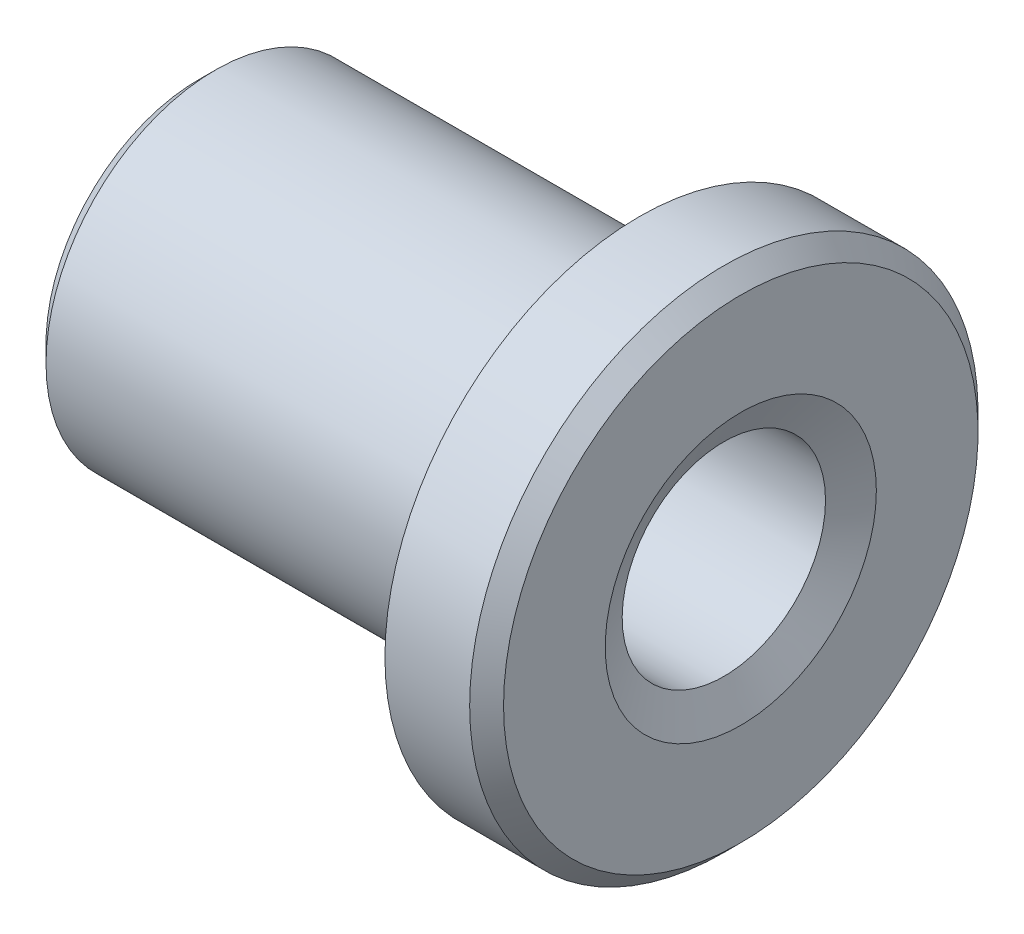
ISO-10303-21;
HEADER;
FILE_DESCRIPTION(('STEP AP214'),'2;1');
FILE_NAME('part.step','',(''),(''),'','','');
FILE_SCHEMA(('AUTOMOTIVE_DESIGN { 1 0 10303 214 1 1 1 1 }'));
ENDSEC;
DATA;
#1=APPLICATION_CONTEXT('core data for automotive mechanical design processes');
#2=APPLICATION_PROTOCOL_DEFINITION('international standard','automotive_design',2000,#1);
#3=PRODUCT_CONTEXT('',#1,'mechanical');
#4=PRODUCT('Part','Part','',(#3));
#5=PRODUCT_RELATED_PRODUCT_CATEGORY('part','',(#4));
#6=PRODUCT_DEFINITION_FORMATION('','',#4);
#7=PRODUCT_DEFINITION_CONTEXT('part definition',#1,'design');
#8=PRODUCT_DEFINITION('design','',#6,#7);
#9=PRODUCT_DEFINITION_SHAPE('','',#8);
#10=(LENGTH_UNIT() NAMED_UNIT(*) SI_UNIT(.MILLI.,.METRE.));
#11=(NAMED_UNIT(*) PLANE_ANGLE_UNIT() SI_UNIT($,.RADIAN.));
#12=(NAMED_UNIT(*) SI_UNIT($,.STERADIAN.) SOLID_ANGLE_UNIT());
#13=UNCERTAINTY_MEASURE_WITH_UNIT(LENGTH_MEASURE(1.E-05),#10,'distance_accuracy_value','');
#14=(GEOMETRIC_REPRESENTATION_CONTEXT(3) GLOBAL_UNCERTAINTY_ASSIGNED_CONTEXT((#13)) GLOBAL_UNIT_ASSIGNED_CONTEXT((#10,
#11,#12)) REPRESENTATION_CONTEXT('',''));
#15=CARTESIAN_POINT('',(0.,0.,0.));
#16=DIRECTION('',(0.,0.,1.));
#17=DIRECTION('',(1.,0.,0.));
#18=AXIS2_PLACEMENT_3D('',#15,#16,#17);
#19=CARTESIAN_POINT('',(-13.,-6.2856101100034,0.99554283937113));
#20=DIRECTION('',(-1.,0.,0.));
#21=DIRECTION('',(0.,0.809016994374947,0.587785252292474));
#22=AXIS2_PLACEMENT_3D('',#19,#20,#21);
#23=PLANE('',#22);
#24=CARTESIAN_POINT('',(-13.,0.,0.));
#25=DIRECTION('',(-1.,0.,0.));
#26=DIRECTION('',(0.,0.,1.));
#27=AXIS2_PLACEMENT_3D('',#24,#25,#26);
#28=CIRCLE('',#27,3.50000000000001);
#29=CARTESIAN_POINT('',(-13.,0.,3.50000000000001));
#30=VERTEX_POINT('',#29);
#31=EDGE_CURVE('E51',#30,#30,#28,.T.);
#32=ORIENTED_EDGE('',*,*,#31,.F.);
#33=EDGE_LOOP('',(#32));
#34=FACE_BOUND('',#33,.T.);
#35=CARTESIAN_POINT('',(-13.,0.,0.));
#36=DIRECTION('',(1.,0.,0.));
#37=DIRECTION('',(0.,0.,-1.));
#38=AXIS2_PLACEMENT_3D('',#35,#36,#37);
#39=CIRCLE('',#38,4.50000000000001);
#40=CARTESIAN_POINT('',(-13.,0.,-4.50000000000001));
#41=VERTEX_POINT('',#40);
#42=EDGE_CURVE('E55',#41,#41,#39,.F.);
#43=ORIENTED_EDGE('',*,*,#42,.T.);
#44=EDGE_LOOP('',(#43));
#45=FACE_BOUND('',#44,.T.);
#46=ADVANCED_FACE('F15',(#34,#45),#23,.T.);
#47=CARTESIAN_POINT('',(-12.5,0.,0.));
#48=DIRECTION('',(1.,0.,0.));
#49=DIRECTION('',(0.,0.,-1.));
#50=AXIS2_PLACEMENT_3D('',#47,#48,#49);
#51=CONICAL_SURFACE('',#50,4.99999999999999,0.785398163397425);
#52=CARTESIAN_POINT('',(-12.5,0.,0.));
#53=DIRECTION('',(-1.,0.,0.));
#54=DIRECTION('',(0.,0.809016994374941,0.587785252292481));
#55=AXIS2_PLACEMENT_3D('',#52,#53,#54);
#56=CIRCLE('',#55,4.99999999999999);
#57=CARTESIAN_POINT('',(-12.5,4.0450849718747,2.9389262614624));
#58=VERTEX_POINT('',#57);
#59=EDGE_CURVE('E54',#58,#58,#56,.T.);
#60=ORIENTED_EDGE('',*,*,#59,.T.);
#61=EDGE_LOOP('',(#60));
#62=FACE_BOUND('',#61,.T.);
#63=ORIENTED_EDGE('',*,*,#42,.F.);
#64=EDGE_LOOP('',(#63));
#65=FACE_BOUND('',#64,.T.);
#66=ADVANCED_FACE('F61',(#62,#65),#51,.T.);
#67=CARTESIAN_POINT('',(-12.5,0.,0.));
#68=DIRECTION('',(-1.,0.,0.));
#69=DIRECTION('',(0.,0.,1.));
#70=AXIS2_PLACEMENT_3D('',#67,#68,#69);
#71=CONICAL_SURFACE('',#70,2.99999999999995,0.785398163397506);
#72=ORIENTED_EDGE('',*,*,#31,.T.);
#73=EDGE_LOOP('',(#72));
#74=FACE_BOUND('',#73,.T.);
#75=CARTESIAN_POINT('',(-12.5,0.,0.));
#76=DIRECTION('',(-1.,0.,0.));
#77=DIRECTION('',(0.,0.809016994374946,0.587785252292476));
#78=AXIS2_PLACEMENT_3D('',#75,#76,#77);
#79=CIRCLE('',#78,2.99999999999995);
#80=CARTESIAN_POINT('',(-12.5,2.4270509831248,1.7633557568774));
#81=VERTEX_POINT('',#80);
#82=EDGE_CURVE('E48',#81,#81,#79,.T.);
#83=ORIENTED_EDGE('',*,*,#82,.F.);
#84=EDGE_LOOP('',(#83));
#85=FACE_BOUND('',#84,.T.);
#86=ADVANCED_FACE('F63',(#74,#85),#71,.F.);
#87=CARTESIAN_POINT('',(0.,0.,0.));
#88=DIRECTION('',(-1.,0.,0.));
#89=DIRECTION('',(0.,0.,1.));
#90=AXIS2_PLACEMENT_3D('',#87,#88,#89);
#91=CYLINDRICAL_SURFACE('',#90,4.99999999999999);
#92=CARTESIAN_POINT('',(0.,0.,0.));
#93=DIRECTION('',(-1.,0.,0.));
#94=DIRECTION('',(0.,0.,1.));
#95=AXIS2_PLACEMENT_3D('',#92,#93,#94);
#96=CIRCLE('',#95,4.99999999999999);
#97=CARTESIAN_POINT('',(0.,0.,4.99999999999999));
#98=VERTEX_POINT('',#97);
#99=EDGE_CURVE('E45',#98,#98,#96,.F.);
#100=ORIENTED_EDGE('',*,*,#99,.F.);
#101=EDGE_LOOP('',(#100));
#102=FACE_BOUND('',#101,.T.);
#103=ORIENTED_EDGE('',*,*,#59,.F.);
#104=EDGE_LOOP('',(#103));
#105=FACE_BOUND('',#104,.T.);
#106=ADVANCED_FACE('F71',(#102,#105),#91,.T.);
#107=CARTESIAN_POINT('',(2.5,0.,0.));
#108=DIRECTION('',(-1.,0.,0.));
#109=DIRECTION('',(0.,0.,1.));
#110=AXIS2_PLACEMENT_3D('',#107,#108,#109);
#111=CYLINDRICAL_SURFACE('',#110,2.99999999999995);
#112=ORIENTED_EDGE('',*,*,#82,.T.);
#113=EDGE_LOOP('',(#112));
#114=FACE_BOUND('',#113,.T.);
#115=CARTESIAN_POINT('',(2.5,0.,0.));
#116=DIRECTION('',(-1.,0.,0.));
#117=DIRECTION('',(0.,0.809016994374946,0.587785252292476));
#118=AXIS2_PLACEMENT_3D('',#115,#116,#117);
#119=CIRCLE('',#118,2.99999999999995);
#120=CARTESIAN_POINT('',(2.5,2.4270509831248,1.7633557568774));
#121=VERTEX_POINT('',#120);
#122=EDGE_CURVE('E42',#121,#121,#119,.T.);
#123=ORIENTED_EDGE('',*,*,#122,.F.);
#124=EDGE_LOOP('',(#123));
#125=FACE_BOUND('',#124,.T.);
#126=ADVANCED_FACE('F92',(#114,#125),#111,.F.);
#127=CARTESIAN_POINT('',(0.,-10.476016850006,1.6592380656186));
#128=DIRECTION('',(-1.,0.,0.));
#129=DIRECTION('',(0.,0.809016994374947,0.587785252292474));
#130=AXIS2_PLACEMENT_3D('',#127,#128,#129);
#131=PLANE('',#130);
#132=ORIENTED_EDGE('',*,*,#99,.T.);
#133=EDGE_LOOP('',(#132));
#134=FACE_BOUND('',#133,.T.);
#135=CARTESIAN_POINT('',(0.,0.,0.));
#136=DIRECTION('',(-1.,0.,0.));
#137=DIRECTION('',(0.,0.,1.));
#138=AXIS2_PLACEMENT_3D('',#135,#136,#137);
#139=CIRCLE('',#138,7.49999999999997);
#140=CARTESIAN_POINT('',(0.,0.,7.49999999999997));
#141=VERTEX_POINT('',#140);
#142=EDGE_CURVE('E37',#141,#141,#139,.T.);
#143=ORIENTED_EDGE('',*,*,#142,.T.);
#144=EDGE_LOOP('',(#143));
#145=FACE_BOUND('',#144,.T.);
#146=ADVANCED_FACE('F89',(#134,#145),#131,.T.);
#147=CARTESIAN_POINT('',(3.,0.,0.));
#148=DIRECTION('',(1.,0.,0.));
#149=DIRECTION('',(0.,0.,-1.));
#150=AXIS2_PLACEMENT_3D('',#147,#148,#149);
#151=CONICAL_SURFACE('',#150,4.00000000000001,1.10714871779411);
#152=ORIENTED_EDGE('',*,*,#122,.T.);
#153=EDGE_LOOP('',(#152));
#154=FACE_BOUND('',#153,.T.);
#155=CARTESIAN_POINT('',(3.,0.,0.));
#156=DIRECTION('',(1.,0.,0.));
#157=DIRECTION('',(0.,0.,-1.));
#158=AXIS2_PLACEMENT_3D('',#155,#156,#157);
#159=CIRCLE('',#158,4.00000000000001);
#160=CARTESIAN_POINT('',(3.,0.,-4.00000000000001));
#161=VERTEX_POINT('',#160);
#162=EDGE_CURVE('E28',#161,#161,#159,.F.);
#163=ORIENTED_EDGE('',*,*,#162,.F.);
#164=EDGE_LOOP('',(#163));
#165=FACE_BOUND('',#164,.T.);
#166=ADVANCED_FACE('F91',(#154,#165),#151,.F.);
#167=CARTESIAN_POINT('',(2.5,0.,0.));
#168=DIRECTION('',(-1.,0.,0.));
#169=DIRECTION('',(0.,0.,1.));
#170=AXIS2_PLACEMENT_3D('',#167,#168,#169);
#171=CYLINDRICAL_SURFACE('',#170,7.49999999999997);
#172=CARTESIAN_POINT('',(2.5,0.,0.));
#173=DIRECTION('',(-1.,0.,0.));
#174=DIRECTION('',(0.,0.80901699437495,0.587785252292469));
#175=AXIS2_PLACEMENT_3D('',#172,#173,#174);
#176=CIRCLE('',#175,7.49999999999997);
#177=CARTESIAN_POINT('',(2.5,6.0676274578121,4.4083893921935));
#178=VERTEX_POINT('',#177);
#179=EDGE_CURVE('E23',#178,#178,#176,.T.);
#180=ORIENTED_EDGE('',*,*,#179,.T.);
#181=EDGE_LOOP('',(#180));
#182=FACE_BOUND('',#181,.T.);
#183=ORIENTED_EDGE('',*,*,#142,.F.);
#184=EDGE_LOOP('',(#183));
#185=FACE_BOUND('',#184,.T.);
#186=ADVANCED_FACE('F84',(#182,#185),#171,.T.);
#187=CARTESIAN_POINT('',(3.,-1.5486221945773,-9.7776157266719));
#188=DIRECTION('',(1.,0.,0.));
#189=DIRECTION('',(0.,0.809016994374947,0.587785252292474));
#190=AXIS2_PLACEMENT_3D('',#187,#188,#189);
#191=PLANE('',#190);
#192=ORIENTED_EDGE('',*,*,#162,.T.);
#193=EDGE_LOOP('',(#192));
#194=FACE_BOUND('',#193,.T.);
#195=CARTESIAN_POINT('',(3.,0.,0.));
#196=DIRECTION('',(-1.,0.,0.));
#197=DIRECTION('',(0.,0.,1.));
#198=AXIS2_PLACEMENT_3D('',#195,#196,#197);
#199=CIRCLE('',#198,6.99999999999997);
#200=CARTESIAN_POINT('',(3.,0.,6.99999999999997));
#201=VERTEX_POINT('',#200);
#202=EDGE_CURVE('E10',#201,#201,#199,.F.);
#203=ORIENTED_EDGE('',*,*,#202,.T.);
#204=EDGE_LOOP('',(#203));
#205=FACE_BOUND('',#204,.T.);
#206=ADVANCED_FACE('F17',(#194,#205),#191,.T.);
#207=CARTESIAN_POINT('',(3.,0.,0.));
#208=DIRECTION('',(-1.,0.,0.));
#209=DIRECTION('',(0.,0.,1.));
#210=AXIS2_PLACEMENT_3D('',#207,#208,#209);
#211=CONICAL_SURFACE('',#210,6.99999999999997,0.78539816339745);
#212=ORIENTED_EDGE('',*,*,#202,.F.);
#213=EDGE_LOOP('',(#212));
#214=FACE_BOUND('',#213,.T.);
#215=ORIENTED_EDGE('',*,*,#179,.F.);
#216=EDGE_LOOP('',(#215));
#217=FACE_BOUND('',#216,.T.);
#218=ADVANCED_FACE('F77',(#214,#217),#211,.T.);
#219=CLOSED_SHELL('',(#46,#66,#86,#106,#126,#146,#166,#186,#206,#218));
#220=MANIFOLD_SOLID_BREP('B1',#219);
#221=ADVANCED_BREP_SHAPE_REPRESENTATION('',(#18,#220),#14);
#222=SHAPE_DEFINITION_REPRESENTATION(#9,#221);
ENDSEC;
END-ISO-10303-21;
